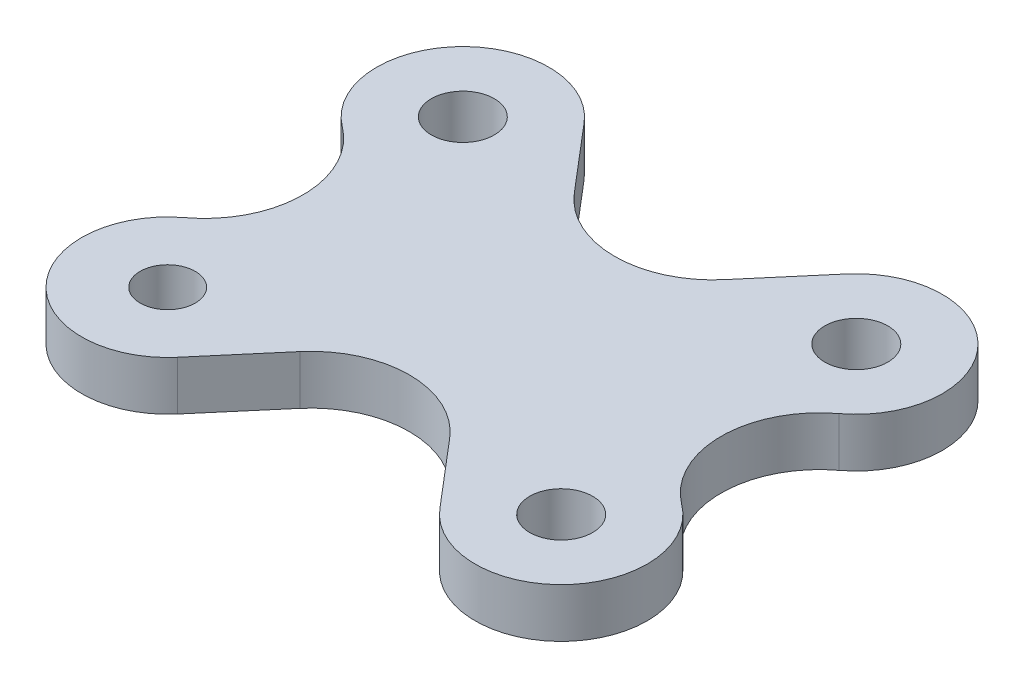
ISO-10303-21;
HEADER;
FILE_DESCRIPTION(('STEP AP214'),'2;1');
FILE_NAME('part.step','',(''),(''),'','','');
FILE_SCHEMA(('AUTOMOTIVE_DESIGN { 1 0 10303 214 1 1 1 1 }'));
ENDSEC;
DATA;
#1=APPLICATION_CONTEXT('core data for automotive mechanical design processes');
#2=APPLICATION_PROTOCOL_DEFINITION('international standard','automotive_design',2000,#1);
#3=PRODUCT_CONTEXT('',#1,'mechanical');
#4=PRODUCT('Part','Part','',(#3));
#5=PRODUCT_RELATED_PRODUCT_CATEGORY('part','',(#4));
#6=PRODUCT_DEFINITION_FORMATION('','',#4);
#7=PRODUCT_DEFINITION_CONTEXT('part definition',#1,'design');
#8=PRODUCT_DEFINITION('design','',#6,#7);
#9=PRODUCT_DEFINITION_SHAPE('','',#8);
#10=(LENGTH_UNIT() NAMED_UNIT(*) SI_UNIT(.MILLI.,.METRE.));
#11=(NAMED_UNIT(*) PLANE_ANGLE_UNIT() SI_UNIT($,.RADIAN.));
#12=(NAMED_UNIT(*) SI_UNIT($,.STERADIAN.) SOLID_ANGLE_UNIT());
#13=UNCERTAINTY_MEASURE_WITH_UNIT(LENGTH_MEASURE(1.E-05),#10,'distance_accuracy_value','');
#14=(GEOMETRIC_REPRESENTATION_CONTEXT(3) GLOBAL_UNCERTAINTY_ASSIGNED_CONTEXT((#13)) GLOBAL_UNIT_ASSIGNED_CONTEXT((#10,
#11,#12)) REPRESENTATION_CONTEXT('',''));
#15=CARTESIAN_POINT('',(0.,0.,0.));
#16=DIRECTION('',(0.,0.,1.));
#17=DIRECTION('',(1.,0.,0.));
#18=AXIS2_PLACEMENT_3D('',#15,#16,#17);
#19=CARTESIAN_POINT('',(-12.7,3.175,9.525));
#20=DIRECTION('',(0.,-1.,0.));
#21=DIRECTION('',(0.,0.,-1.));
#22=AXIS2_PLACEMENT_3D('',#19,#20,#21);
#23=CYLINDRICAL_SURFACE('',#22,5.55625);
#24=CARTESIAN_POINT('',(-12.7,3.175,9.525));
#25=DIRECTION('',(0.,1.,0.));
#26=DIRECTION('',(0.,0.,1.));
#27=AXIS2_PLACEMENT_3D('',#24,#25,#26);
#28=CIRCLE('',#27,5.55625);
#29=CARTESIAN_POINT('',(-16.03375,3.175,5.08));
#30=VERTEX_POINT('',#29);
#31=CARTESIAN_POINT('',(-8.46862702876966,3.175,13.1260271924607));
#32=VERTEX_POINT('',#31);
#33=EDGE_CURVE('E146',#30,#32,#28,.T.);
#34=ORIENTED_EDGE('',*,*,#33,.F.);
#35=DIRECTION('',(0.,-1.,0.));
#36=VECTOR('',#35,1.);
#37=CARTESIAN_POINT('',(-16.03375,3.175,5.08));
#38=LINE('',#37,#36);
#39=CARTESIAN_POINT('',(-16.03375,0.,5.08));
#40=VERTEX_POINT('',#39);
#41=EDGE_CURVE('E180',#30,#40,#38,.T.);
#42=ORIENTED_EDGE('',*,*,#41,.T.);
#43=CARTESIAN_POINT('',(-12.7,0.,9.525));
#44=DIRECTION('',(0.,1.,0.));
#45=DIRECTION('',(0.,0.,1.));
#46=AXIS2_PLACEMENT_3D('',#43,#44,#45);
#47=CIRCLE('',#46,5.55625);
#48=CARTESIAN_POINT('',(-8.46862702876966,0.,13.1260271924607));
#49=VERTEX_POINT('',#48);
#50=EDGE_CURVE('E165',#40,#49,#47,.T.);
#51=ORIENTED_EDGE('',*,*,#50,.T.);
#52=DIRECTION('',(0.,-1.,0.));
#53=VECTOR('',#52,1.);
#54=CARTESIAN_POINT('',(-8.46862702876966,3.175,13.1260271924607));
#55=LINE('',#54,#53);
#56=EDGE_CURVE('E161',#32,#49,#55,.T.);
#57=ORIENTED_EDGE('',*,*,#56,.F.);
#58=EDGE_LOOP('',(#34,#42,#51,#57));
#59=FACE_BOUND('',#58,.T.);
#60=ADVANCED_FACE('F45',(#59),#23,.T.);
#61=CARTESIAN_POINT('',(-8.46862702876966,3.175,13.1260271924607));
#62=DIRECTION('',(-0.761551940828858,0.,-0.648103881657716));
#63=DIRECTION('',(-0.648103881657716,0.,0.761551940828858));
#64=AXIS2_PLACEMENT_3D('',#61,#62,#63);
#65=PLANE('',#64);
#66=DIRECTION('',(0.648103881657716,0.,-0.761551940828858));
#67=VECTOR('',#66,1.);
#68=CARTESIAN_POINT('',(-8.46862702876966,0.,13.1260271924607));
#69=LINE('',#68,#67);
#70=CARTESIAN_POINT('',(-4.83585482426325,0.,8.8573523685193));
#71=VERTEX_POINT('',#70);
#72=EDGE_CURVE('E261',#49,#71,#69,.T.);
#73=ORIENTED_EDGE('',*,*,#72,.T.);
#74=DIRECTION('',(0.,-1.,0.));
#75=VECTOR('',#74,1.);
#76=CARTESIAN_POINT('',(-4.83585482426325,3.175,8.8573523685193));
#77=LINE('',#76,#75);
#78=CARTESIAN_POINT('',(-4.83585482426325,3.175,8.8573523685193));
#79=VERTEX_POINT('',#78);
#80=EDGE_CURVE('E61',#71,#79,#77,.F.);
#81=ORIENTED_EDGE('',*,*,#80,.T.);
#82=DIRECTION('',(0.648103881657716,0.,-0.761551940828858));
#83=VECTOR('',#82,1.);
#84=CARTESIAN_POINT('',(-8.46862702876966,3.175,13.1260271924607));
#85=LINE('',#84,#83);
#86=EDGE_CURVE('E149',#32,#79,#85,.T.);
#87=ORIENTED_EDGE('',*,*,#86,.F.);
#88=ORIENTED_EDGE('',*,*,#56,.T.);
#89=EDGE_LOOP('',(#73,#81,#87,#88));
#90=FACE_BOUND('',#89,.T.);
#91=ADVANCED_FACE('F160',(#90),#65,.F.);
#92=CARTESIAN_POINT('',(0.,3.175,3.175));
#93=DIRECTION('',(0.761551940828858,0.,-0.648103881657716));
#94=DIRECTION('',(-0.648103881657716,0.,-0.761551940828858));
#95=AXIS2_PLACEMENT_3D('',#92,#93,#94);
#96=PLANE('',#95);
#97=DIRECTION('',(0.648103881657716,0.,0.761551940828858));
#98=VECTOR('',#97,1.);
#99=CARTESIAN_POINT('',(0.,3.175,3.175));
#100=LINE('',#99,#98);
#101=CARTESIAN_POINT('',(4.83585482426325,3.175,8.8573523685193));
#102=VERTEX_POINT('',#101);
#103=CARTESIAN_POINT('',(8.46862702876966,3.175,13.1260271924607));
#104=VERTEX_POINT('',#103);
#105=EDGE_CURVE('E162',#102,#104,#100,.T.);
#106=ORIENTED_EDGE('',*,*,#105,.F.);
#107=DIRECTION('',(0.,-1.,0.));
#108=VECTOR('',#107,1.);
#109=CARTESIAN_POINT('',(4.83585482426325,0.,8.8573523685193));
#110=LINE('',#109,#108);
#111=CARTESIAN_POINT('',(4.83585482426325,0.,8.8573523685193));
#112=VERTEX_POINT('',#111);
#113=EDGE_CURVE('E191',#102,#112,#110,.T.);
#114=ORIENTED_EDGE('',*,*,#113,.T.);
#115=DIRECTION('',(0.648103881657716,0.,0.761551940828858));
#116=VECTOR('',#115,1.);
#117=CARTESIAN_POINT('',(0.,0.,3.175));
#118=LINE('',#117,#116);
#119=CARTESIAN_POINT('',(8.46862702876966,0.,13.1260271924607));
#120=VERTEX_POINT('',#119);
#121=EDGE_CURVE('E264',#112,#120,#118,.T.);
#122=ORIENTED_EDGE('',*,*,#121,.T.);
#123=DIRECTION('',(0.,-1.,0.));
#124=VECTOR('',#123,1.);
#125=CARTESIAN_POINT('',(8.46862702876966,3.175,13.1260271924607));
#126=LINE('',#125,#124);
#127=EDGE_CURVE('E167',#104,#120,#126,.T.);
#128=ORIENTED_EDGE('',*,*,#127,.F.);
#129=EDGE_LOOP('',(#106,#114,#122,#128));
#130=FACE_BOUND('',#129,.T.);
#131=ADVANCED_FACE('F303',(#130),#96,.F.);
#132=CARTESIAN_POINT('',(12.7,3.175,9.525));
#133=DIRECTION('',(0.,-1.,0.));
#134=DIRECTION('',(0.,0.,-1.));
#135=AXIS2_PLACEMENT_3D('',#132,#133,#134);
#136=CYLINDRICAL_SURFACE('',#135,5.55625);
#137=CARTESIAN_POINT('',(12.7,0.,9.525));
#138=DIRECTION('',(0.,1.,0.));
#139=DIRECTION('',(0.,0.,1.));
#140=AXIS2_PLACEMENT_3D('',#137,#138,#139);
#141=CIRCLE('',#140,5.55625);
#142=CARTESIAN_POINT('',(16.03375,0.,5.08));
#143=VERTEX_POINT('',#142);
#144=EDGE_CURVE('E221',#120,#143,#141,.T.);
#145=ORIENTED_EDGE('',*,*,#144,.T.);
#146=DIRECTION('',(0.,-1.,0.));
#147=VECTOR('',#146,1.);
#148=CARTESIAN_POINT('',(16.03375,3.175,5.08));
#149=LINE('',#148,#147);
#150=CARTESIAN_POINT('',(16.03375,3.175,5.08));
#151=VERTEX_POINT('',#150);
#152=EDGE_CURVE('E188',#143,#151,#149,.F.);
#153=ORIENTED_EDGE('',*,*,#152,.T.);
#154=CARTESIAN_POINT('',(12.7,3.175,9.525));
#155=DIRECTION('',(0.,1.,0.));
#156=DIRECTION('',(0.,0.,1.));
#157=AXIS2_PLACEMENT_3D('',#154,#155,#156);
#158=CIRCLE('',#157,5.55625);
#159=EDGE_CURVE('E216',#104,#151,#158,.T.);
#160=ORIENTED_EDGE('',*,*,#159,.F.);
#161=ORIENTED_EDGE('',*,*,#127,.T.);
#162=EDGE_LOOP('',(#145,#153,#160,#161));
#163=FACE_BOUND('',#162,.T.);
#164=ADVANCED_FACE('F271',(#163),#136,.T.);
#165=CARTESIAN_POINT('',(12.7,3.175,-9.525));
#166=DIRECTION('',(0.,-1.,0.));
#167=DIRECTION('',(0.,0.,-1.));
#168=AXIS2_PLACEMENT_3D('',#165,#166,#167);
#169=CYLINDRICAL_SURFACE('',#168,5.55625);
#170=CARTESIAN_POINT('',(12.7,3.175,-9.525));
#171=DIRECTION('',(0.,1.,0.));
#172=DIRECTION('',(0.,0.,1.));
#173=AXIS2_PLACEMENT_3D('',#170,#171,#172);
#174=CIRCLE('',#173,5.55625);
#175=CARTESIAN_POINT('',(16.03375,3.175,-5.08));
#176=VERTEX_POINT('',#175);
#177=CARTESIAN_POINT('',(8.46862702876966,3.175,-13.1260271924607));
#178=VERTEX_POINT('',#177);
#179=EDGE_CURVE('E213',#176,#178,#174,.T.);
#180=ORIENTED_EDGE('',*,*,#179,.F.);
#181=DIRECTION('',(0.,-1.,0.));
#182=VECTOR('',#181,1.);
#183=CARTESIAN_POINT('',(16.03375,3.175,-5.08));
#184=LINE('',#183,#182);
#185=CARTESIAN_POINT('',(16.03375,0.,-5.08));
#186=VERTEX_POINT('',#185);
#187=EDGE_CURVE('E184',#176,#186,#184,.T.);
#188=ORIENTED_EDGE('',*,*,#187,.T.);
#189=CARTESIAN_POINT('',(12.7,0.,-9.525));
#190=DIRECTION('',(0.,1.,0.));
#191=DIRECTION('',(0.,0.,1.));
#192=AXIS2_PLACEMENT_3D('',#189,#190,#191);
#193=CIRCLE('',#192,5.55625);
#194=CARTESIAN_POINT('',(8.46862702876966,0.,-13.1260271924607));
#195=VERTEX_POINT('',#194);
#196=EDGE_CURVE('E218',#186,#195,#193,.T.);
#197=ORIENTED_EDGE('',*,*,#196,.T.);
#198=DIRECTION('',(0.,-1.,0.));
#199=VECTOR('',#198,1.);
#200=CARTESIAN_POINT('',(8.46862702876966,3.175,-13.1260271924607));
#201=LINE('',#200,#199);
#202=EDGE_CURVE('E174',#178,#195,#201,.T.);
#203=ORIENTED_EDGE('',*,*,#202,.F.);
#204=EDGE_LOOP('',(#180,#188,#197,#203));
#205=FACE_BOUND('',#204,.T.);
#206=ADVANCED_FACE('F282',(#205),#169,.T.);
#207=CARTESIAN_POINT('',(8.46862702876966,3.175,-13.1260271924607));
#208=DIRECTION('',(0.761551940828858,0.,0.648103881657716));
#209=DIRECTION('',(0.648103881657716,0.,-0.761551940828858));
#210=AXIS2_PLACEMENT_3D('',#207,#208,#209);
#211=PLANE('',#210);
#212=DIRECTION('',(-0.648103881657716,0.,0.761551940828858));
#213=VECTOR('',#212,1.);
#214=CARTESIAN_POINT('',(8.46862702876966,0.,-13.1260271924607));
#215=LINE('',#214,#213);
#216=CARTESIAN_POINT('',(4.83585482426325,0.,-8.8573523685193));
#217=VERTEX_POINT('',#216);
#218=EDGE_CURVE('E220',#195,#217,#215,.T.);
#219=ORIENTED_EDGE('',*,*,#218,.T.);
#220=DIRECTION('',(0.,-1.,0.));
#221=VECTOR('',#220,1.);
#222=CARTESIAN_POINT('',(4.83585482426325,3.175,-8.8573523685193));
#223=LINE('',#222,#221);
#224=CARTESIAN_POINT('',(4.83585482426325,3.175,-8.8573523685193));
#225=VERTEX_POINT('',#224);
#226=EDGE_CURVE('E170',#217,#225,#223,.F.);
#227=ORIENTED_EDGE('',*,*,#226,.T.);
#228=DIRECTION('',(-0.648103881657716,0.,0.761551940828858));
#229=VECTOR('',#228,1.);
#230=CARTESIAN_POINT('',(8.46862702876966,3.175,-13.1260271924607));
#231=LINE('',#230,#229);
#232=EDGE_CURVE('E215',#178,#225,#231,.T.);
#233=ORIENTED_EDGE('',*,*,#232,.F.);
#234=ORIENTED_EDGE('',*,*,#202,.T.);
#235=EDGE_LOOP('',(#219,#227,#233,#234));
#236=FACE_BOUND('',#235,.T.);
#237=ADVANCED_FACE('F285',(#236),#211,.F.);
#238=CARTESIAN_POINT('',(0.,3.175,-3.175));
#239=DIRECTION('',(-0.761551940828858,0.,0.648103881657716));
#240=DIRECTION('',(0.648103881657716,0.,0.761551940828858));
#241=AXIS2_PLACEMENT_3D('',#238,#239,#240);
#242=PLANE('',#241);
#243=DIRECTION('',(-0.648103881657716,0.,-0.761551940828858));
#244=VECTOR('',#243,1.);
#245=CARTESIAN_POINT('',(0.,3.175,-3.175));
#246=LINE('',#245,#244);
#247=CARTESIAN_POINT('',(-4.83585482426325,3.175,-8.8573523685193));
#248=VERTEX_POINT('',#247);
#249=CARTESIAN_POINT('',(-8.46862702876965,3.175,-13.1260271924607));
#250=VERTEX_POINT('',#249);
#251=EDGE_CURVE('E234',#248,#250,#246,.T.);
#252=ORIENTED_EDGE('',*,*,#251,.F.);
#253=DIRECTION('',(0.,-1.,0.));
#254=VECTOR('',#253,1.);
#255=CARTESIAN_POINT('',(-4.83585482426325,0.,-8.8573523685193));
#256=LINE('',#255,#254);
#257=CARTESIAN_POINT('',(-4.83585482426325,0.,-8.8573523685193));
#258=VERTEX_POINT('',#257);
#259=EDGE_CURVE('E166',#248,#258,#256,.T.);
#260=ORIENTED_EDGE('',*,*,#259,.T.);
#261=DIRECTION('',(-0.648103881657716,0.,-0.761551940828858));
#262=VECTOR('',#261,1.);
#263=CARTESIAN_POINT('',(0.,0.,-3.175));
#264=LINE('',#263,#262);
#265=CARTESIAN_POINT('',(-8.46862702876965,0.,-13.1260271924607));
#266=VERTEX_POINT('',#265);
#267=EDGE_CURVE('E241',#258,#266,#264,.T.);
#268=ORIENTED_EDGE('',*,*,#267,.T.);
#269=DIRECTION('',(0.,-1.,0.));
#270=VECTOR('',#269,1.);
#271=CARTESIAN_POINT('',(-8.46862702876965,3.175,-13.1260271924607));
#272=LINE('',#271,#270);
#273=EDGE_CURVE('E239',#250,#266,#272,.T.);
#274=ORIENTED_EDGE('',*,*,#273,.F.);
#275=EDGE_LOOP('',(#252,#260,#268,#274));
#276=FACE_BOUND('',#275,.T.);
#277=ADVANCED_FACE('F293',(#276),#242,.F.);
#278=CARTESIAN_POINT('',(-12.7,3.175,-9.525));
#279=DIRECTION('',(0.,-1.,0.));
#280=DIRECTION('',(0.,0.,-1.));
#281=AXIS2_PLACEMENT_3D('',#278,#279,#280);
#282=CYLINDRICAL_SURFACE('',#281,5.55625);
#283=CARTESIAN_POINT('',(-12.7,0.,-9.525));
#284=DIRECTION('',(0.,1.,0.));
#285=DIRECTION('',(0.,0.,1.));
#286=AXIS2_PLACEMENT_3D('',#283,#284,#285);
#287=CIRCLE('',#286,5.55625);
#288=CARTESIAN_POINT('',(-16.03375,0.,-5.08));
#289=VERTEX_POINT('',#288);
#290=EDGE_CURVE('E157',#266,#289,#287,.T.);
#291=ORIENTED_EDGE('',*,*,#290,.T.);
#292=DIRECTION('',(0.,-1.,0.));
#293=VECTOR('',#292,1.);
#294=CARTESIAN_POINT('',(-16.03375,3.175,-5.08));
#295=LINE('',#294,#293);
#296=CARTESIAN_POINT('',(-16.03375,3.175,-5.08));
#297=VERTEX_POINT('',#296);
#298=EDGE_CURVE('E182',#289,#297,#295,.F.);
#299=ORIENTED_EDGE('',*,*,#298,.T.);
#300=CARTESIAN_POINT('',(-12.7,3.175,-9.525));
#301=DIRECTION('',(0.,1.,0.));
#302=DIRECTION('',(0.,0.,1.));
#303=AXIS2_PLACEMENT_3D('',#300,#301,#302);
#304=CIRCLE('',#303,5.55625);
#305=EDGE_CURVE('E252',#250,#297,#304,.T.);
#306=ORIENTED_EDGE('',*,*,#305,.F.);
#307=ORIENTED_EDGE('',*,*,#273,.T.);
#308=EDGE_LOOP('',(#291,#299,#306,#307));
#309=FACE_BOUND('',#308,.T.);
#310=ADVANCED_FACE('F296',(#309),#282,.T.);
#311=CARTESIAN_POINT('',(-12.7,3.175,9.525));
#312=DIRECTION('',(0.,1.,0.));
#313=DIRECTION('',(0.,0.,1.));
#314=AXIS2_PLACEMENT_3D('',#311,#312,#313);
#315=PLANE('',#314);
#316=CARTESIAN_POINT('',(-12.7,3.175,9.525));
#317=DIRECTION('',(0.,1.,0.));
#318=DIRECTION('',(0.,0.,1.));
#319=AXIS2_PLACEMENT_3D('',#316,#317,#318);
#320=CIRCLE('',#319,1.778);
#321=CARTESIAN_POINT('',(-12.7,3.175,11.303));
#322=VERTEX_POINT('',#321);
#323=EDGE_CURVE('E316',#322,#322,#320,.T.);
#324=ORIENTED_EDGE('',*,*,#323,.F.);
#325=EDGE_LOOP('',(#324));
#326=FACE_BOUND('',#325,.T.);
#327=CARTESIAN_POINT('',(12.7,3.175,9.525));
#328=DIRECTION('',(0.,1.,0.));
#329=DIRECTION('',(0.,0.,1.));
#330=AXIS2_PLACEMENT_3D('',#327,#328,#329);
#331=CIRCLE('',#330,2.032);
#332=CARTESIAN_POINT('',(12.7,3.175,11.557));
#333=VERTEX_POINT('',#332);
#334=EDGE_CURVE('E231',#333,#333,#331,.T.);
#335=ORIENTED_EDGE('',*,*,#334,.F.);
#336=EDGE_LOOP('',(#335));
#337=FACE_BOUND('',#336,.T.);
#338=CARTESIAN_POINT('',(12.7,3.175,-9.525));
#339=DIRECTION('',(0.,1.,0.));
#340=DIRECTION('',(0.,0.,1.));
#341=AXIS2_PLACEMENT_3D('',#338,#339,#340);
#342=CIRCLE('',#341,2.032);
#343=CARTESIAN_POINT('',(12.7,3.175,-7.493));
#344=VERTEX_POINT('',#343);
#345=EDGE_CURVE('E223',#344,#344,#342,.T.);
#346=ORIENTED_EDGE('',*,*,#345,.F.);
#347=EDGE_LOOP('',(#346));
#348=FACE_BOUND('',#347,.T.);
#349=CARTESIAN_POINT('',(-12.7,3.175,-9.525));
#350=DIRECTION('',(0.,1.,0.));
#351=DIRECTION('',(0.,0.,1.));
#352=AXIS2_PLACEMENT_3D('',#349,#350,#351);
#353=CIRCLE('',#352,2.032);
#354=CARTESIAN_POINT('',(-12.7,3.175,-7.493));
#355=VERTEX_POINT('',#354);
#356=EDGE_CURVE('E226',#355,#355,#353,.T.);
#357=ORIENTED_EDGE('',*,*,#356,.F.);
#358=EDGE_LOOP('',(#357));
#359=FACE_BOUND('',#358,.T.);
#360=ORIENTED_EDGE('',*,*,#305,.T.);
#361=CARTESIAN_POINT('',(-19.84375,3.175,0.));
#362=DIRECTION('',(0.,1.,0.));
#363=DIRECTION('',(0.,0.,1.));
#364=AXIS2_PLACEMENT_3D('',#361,#362,#363);
#365=CIRCLE('',#364,6.35);
#366=EDGE_CURVE('E152',#297,#30,#365,.F.);
#367=ORIENTED_EDGE('',*,*,#366,.T.);
#368=ORIENTED_EDGE('',*,*,#33,.T.);
#369=ORIENTED_EDGE('',*,*,#86,.T.);
#370=CARTESIAN_POINT('',(0.,3.175,12.9728120170458));
#371=DIRECTION('',(0.,1.,0.));
#372=DIRECTION('',(0.,0.,1.));
#373=AXIS2_PLACEMENT_3D('',#370,#371,#372);
#374=CIRCLE('',#373,6.35);
#375=EDGE_CURVE('E11',#79,#102,#374,.F.);
#376=ORIENTED_EDGE('',*,*,#375,.T.);
#377=ORIENTED_EDGE('',*,*,#105,.T.);
#378=ORIENTED_EDGE('',*,*,#159,.T.);
#379=CARTESIAN_POINT('',(19.84375,3.175,0.));
#380=DIRECTION('',(0.,1.,0.));
#381=DIRECTION('',(0.,0.,1.));
#382=AXIS2_PLACEMENT_3D('',#379,#380,#381);
#383=CIRCLE('',#382,6.35);
#384=EDGE_CURVE('E208',#151,#176,#383,.F.);
#385=ORIENTED_EDGE('',*,*,#384,.T.);
#386=ORIENTED_EDGE('',*,*,#179,.T.);
#387=ORIENTED_EDGE('',*,*,#232,.T.);
#388=CARTESIAN_POINT('',(0.,3.175,-12.9728120170458));
#389=DIRECTION('',(0.,1.,0.));
#390=DIRECTION('',(0.,0.,1.));
#391=AXIS2_PLACEMENT_3D('',#388,#389,#390);
#392=CIRCLE('',#391,6.35);
#393=EDGE_CURVE('E199',#225,#248,#392,.F.);
#394=ORIENTED_EDGE('',*,*,#393,.T.);
#395=ORIENTED_EDGE('',*,*,#251,.T.);
#396=EDGE_LOOP('',(#360,#367,#368,#369,#376,#377,#378,#385,#386,#387,#394,#395));
#397=FACE_BOUND('',#396,.T.);
#398=ADVANCED_FACE('F148',(#326,#337,#348,#359,#397),#315,.T.);
#399=CARTESIAN_POINT('',(-12.7,0.,9.525));
#400=DIRECTION('',(0.,1.,0.));
#401=DIRECTION('',(0.,0.,1.));
#402=AXIS2_PLACEMENT_3D('',#399,#400,#401);
#403=PLANE('',#402);
#404=CARTESIAN_POINT('',(-12.7,0.,9.525));
#405=DIRECTION('',(0.,1.,0.));
#406=DIRECTION('',(0.,0.,1.));
#407=AXIS2_PLACEMENT_3D('',#404,#405,#406);
#408=CIRCLE('',#407,1.778);
#409=CARTESIAN_POINT('',(-12.7,0.,11.303));
#410=VERTEX_POINT('',#409);
#411=EDGE_CURVE('E313',#410,#410,#408,.T.);
#412=ORIENTED_EDGE('',*,*,#411,.T.);
#413=EDGE_LOOP('',(#412));
#414=FACE_BOUND('',#413,.T.);
#415=CARTESIAN_POINT('',(12.7,0.,9.525));
#416=DIRECTION('',(0.,1.,0.));
#417=DIRECTION('',(0.,0.,1.));
#418=AXIS2_PLACEMENT_3D('',#415,#416,#417);
#419=CIRCLE('',#418,2.032);
#420=CARTESIAN_POINT('',(12.7,0.,11.557));
#421=VERTEX_POINT('',#420);
#422=EDGE_CURVE('E319',#421,#421,#419,.T.);
#423=ORIENTED_EDGE('',*,*,#422,.T.);
#424=EDGE_LOOP('',(#423));
#425=FACE_BOUND('',#424,.T.);
#426=CARTESIAN_POINT('',(12.7,0.,-9.525));
#427=DIRECTION('',(0.,1.,0.));
#428=DIRECTION('',(0.,0.,1.));
#429=AXIS2_PLACEMENT_3D('',#426,#427,#428);
#430=CIRCLE('',#429,2.032);
#431=CARTESIAN_POINT('',(12.7,0.,-7.493));
#432=VERTEX_POINT('',#431);
#433=EDGE_CURVE('E227',#432,#432,#430,.T.);
#434=ORIENTED_EDGE('',*,*,#433,.T.);
#435=EDGE_LOOP('',(#434));
#436=FACE_BOUND('',#435,.T.);
#437=CARTESIAN_POINT('',(-12.7,0.,-9.525));
#438=DIRECTION('',(0.,1.,0.));
#439=DIRECTION('',(0.,0.,1.));
#440=AXIS2_PLACEMENT_3D('',#437,#438,#439);
#441=CIRCLE('',#440,2.032);
#442=CARTESIAN_POINT('',(-12.7,0.,-7.493));
#443=VERTEX_POINT('',#442);
#444=EDGE_CURVE('E262',#443,#443,#441,.T.);
#445=ORIENTED_EDGE('',*,*,#444,.T.);
#446=EDGE_LOOP('',(#445));
#447=FACE_BOUND('',#446,.T.);
#448=ORIENTED_EDGE('',*,*,#50,.F.);
#449=CARTESIAN_POINT('',(-19.84375,0.,0.));
#450=DIRECTION('',(0.,1.,0.));
#451=DIRECTION('',(0.,0.,1.));
#452=AXIS2_PLACEMENT_3D('',#449,#450,#451);
#453=CIRCLE('',#452,6.35);
#454=EDGE_CURVE('E202',#40,#289,#453,.T.);
#455=ORIENTED_EDGE('',*,*,#454,.T.);
#456=ORIENTED_EDGE('',*,*,#290,.F.);
#457=ORIENTED_EDGE('',*,*,#267,.F.);
#458=CARTESIAN_POINT('',(0.,0.,-12.9728120170458));
#459=DIRECTION('',(0.,1.,0.));
#460=DIRECTION('',(0.,0.,1.));
#461=AXIS2_PLACEMENT_3D('',#458,#459,#460);
#462=CIRCLE('',#461,6.35);
#463=EDGE_CURVE('E196',#258,#217,#462,.T.);
#464=ORIENTED_EDGE('',*,*,#463,.T.);
#465=ORIENTED_EDGE('',*,*,#218,.F.);
#466=ORIENTED_EDGE('',*,*,#196,.F.);
#467=CARTESIAN_POINT('',(19.84375,0.,0.));
#468=DIRECTION('',(0.,1.,0.));
#469=DIRECTION('',(0.,0.,1.));
#470=AXIS2_PLACEMENT_3D('',#467,#468,#469);
#471=CIRCLE('',#470,6.35);
#472=EDGE_CURVE('E205',#186,#143,#471,.T.);
#473=ORIENTED_EDGE('',*,*,#472,.T.);
#474=ORIENTED_EDGE('',*,*,#144,.F.);
#475=ORIENTED_EDGE('',*,*,#121,.F.);
#476=CARTESIAN_POINT('',(0.,0.,12.9728120170458));
#477=DIRECTION('',(0.,1.,0.));
#478=DIRECTION('',(0.,0.,1.));
#479=AXIS2_PLACEMENT_3D('',#476,#477,#478);
#480=CIRCLE('',#479,6.35);
#481=EDGE_CURVE('E54',#112,#71,#480,.T.);
#482=ORIENTED_EDGE('',*,*,#481,.T.);
#483=ORIENTED_EDGE('',*,*,#72,.F.);
#484=EDGE_LOOP('',(#448,#455,#456,#457,#464,#465,#466,#473,#474,#475,#482,#483));
#485=FACE_BOUND('',#484,.T.);
#486=ADVANCED_FACE('F294',(#414,#425,#436,#447,#485),#403,.F.);
#487=CARTESIAN_POINT('',(0.,3.175,-12.9728120170458));
#488=DIRECTION('',(0.,1.,0.));
#489=DIRECTION('',(0.,0.,1.));
#490=AXIS2_PLACEMENT_3D('',#487,#488,#489);
#491=CYLINDRICAL_SURFACE('',#490,6.35);
#492=ORIENTED_EDGE('',*,*,#393,.F.);
#493=ORIENTED_EDGE('',*,*,#226,.F.);
#494=ORIENTED_EDGE('',*,*,#463,.F.);
#495=ORIENTED_EDGE('',*,*,#259,.F.);
#496=EDGE_LOOP('',(#492,#493,#494,#495));
#497=FACE_BOUND('',#496,.T.);
#498=ADVANCED_FACE('F290',(#497),#491,.F.);
#499=CARTESIAN_POINT('',(-19.84375,3.175,0.));
#500=DIRECTION('',(0.,1.,0.));
#501=DIRECTION('',(0.,0.,1.));
#502=AXIS2_PLACEMENT_3D('',#499,#500,#501);
#503=CYLINDRICAL_SURFACE('',#502,6.35);
#504=ORIENTED_EDGE('',*,*,#366,.F.);
#505=ORIENTED_EDGE('',*,*,#298,.F.);
#506=ORIENTED_EDGE('',*,*,#454,.F.);
#507=ORIENTED_EDGE('',*,*,#41,.F.);
#508=EDGE_LOOP('',(#504,#505,#506,#507));
#509=FACE_BOUND('',#508,.T.);
#510=ADVANCED_FACE('F298',(#509),#503,.F.);
#511=CARTESIAN_POINT('',(19.84375,3.175,0.));
#512=DIRECTION('',(0.,1.,0.));
#513=DIRECTION('',(0.,0.,1.));
#514=AXIS2_PLACEMENT_3D('',#511,#512,#513);
#515=CYLINDRICAL_SURFACE('',#514,6.35);
#516=ORIENTED_EDGE('',*,*,#384,.F.);
#517=ORIENTED_EDGE('',*,*,#152,.F.);
#518=ORIENTED_EDGE('',*,*,#472,.F.);
#519=ORIENTED_EDGE('',*,*,#187,.F.);
#520=EDGE_LOOP('',(#516,#517,#518,#519));
#521=FACE_BOUND('',#520,.T.);
#522=ADVANCED_FACE('F277',(#521),#515,.F.);
#523=CARTESIAN_POINT('',(0.,3.175,12.9728120170458));
#524=DIRECTION('',(0.,1.,0.));
#525=DIRECTION('',(0.,0.,1.));
#526=AXIS2_PLACEMENT_3D('',#523,#524,#525);
#527=CYLINDRICAL_SURFACE('',#526,6.35);
#528=ORIENTED_EDGE('',*,*,#375,.F.);
#529=ORIENTED_EDGE('',*,*,#80,.F.);
#530=ORIENTED_EDGE('',*,*,#481,.F.);
#531=ORIENTED_EDGE('',*,*,#113,.F.);
#532=EDGE_LOOP('',(#528,#529,#530,#531));
#533=FACE_BOUND('',#532,.T.);
#534=ADVANCED_FACE('F47',(#533),#527,.F.);
#535=CARTESIAN_POINT('',(-12.7,0.,-9.525));
#536=DIRECTION('',(0.,1.,0.));
#537=DIRECTION('',(0.,0.,1.));
#538=AXIS2_PLACEMENT_3D('',#535,#536,#537);
#539=CYLINDRICAL_SURFACE('',#538,2.032);
#540=ORIENTED_EDGE('',*,*,#444,.F.);
#541=EDGE_LOOP('',(#540));
#542=FACE_BOUND('',#541,.T.);
#543=ORIENTED_EDGE('',*,*,#356,.T.);
#544=EDGE_LOOP('',(#543));
#545=FACE_BOUND('',#544,.T.);
#546=ADVANCED_FACE('F336',(#542,#545),#539,.F.);
#547=CARTESIAN_POINT('',(12.7,0.,-9.525));
#548=DIRECTION('',(0.,1.,0.));
#549=DIRECTION('',(0.,0.,1.));
#550=AXIS2_PLACEMENT_3D('',#547,#548,#549);
#551=CYLINDRICAL_SURFACE('',#550,2.032);
#552=ORIENTED_EDGE('',*,*,#433,.F.);
#553=EDGE_LOOP('',(#552));
#554=FACE_BOUND('',#553,.T.);
#555=ORIENTED_EDGE('',*,*,#345,.T.);
#556=EDGE_LOOP('',(#555));
#557=FACE_BOUND('',#556,.T.);
#558=ADVANCED_FACE('F338',(#554,#557),#551,.F.);
#559=CARTESIAN_POINT('',(12.7,0.,9.525));
#560=DIRECTION('',(0.,1.,0.));
#561=DIRECTION('',(0.,0.,1.));
#562=AXIS2_PLACEMENT_3D('',#559,#560,#561);
#563=CYLINDRICAL_SURFACE('',#562,2.032);
#564=ORIENTED_EDGE('',*,*,#422,.F.);
#565=EDGE_LOOP('',(#564));
#566=FACE_BOUND('',#565,.T.);
#567=ORIENTED_EDGE('',*,*,#334,.T.);
#568=EDGE_LOOP('',(#567));
#569=FACE_BOUND('',#568,.T.);
#570=ADVANCED_FACE('F326',(#566,#569),#563,.F.);
#571=CARTESIAN_POINT('',(-12.7,0.,9.525));
#572=DIRECTION('',(0.,1.,0.));
#573=DIRECTION('',(0.,0.,1.));
#574=AXIS2_PLACEMENT_3D('',#571,#572,#573);
#575=CYLINDRICAL_SURFACE('',#574,1.778);
#576=ORIENTED_EDGE('',*,*,#411,.F.);
#577=EDGE_LOOP('',(#576));
#578=FACE_BOUND('',#577,.T.);
#579=ORIENTED_EDGE('',*,*,#323,.T.);
#580=EDGE_LOOP('',(#579));
#581=FACE_BOUND('',#580,.T.);
#582=ADVANCED_FACE('F440',(#578,#581),#575,.F.);
#583=CLOSED_SHELL('',(#60,#91,#131,#164,#206,#237,#277,#310,#398,#486,#498,#510,#522,#534,#546,
#558,#570,#582));
#584=MANIFOLD_SOLID_BREP('B2',#583);
#585=ADVANCED_BREP_SHAPE_REPRESENTATION('',(#18,#584),#14);
#586=SHAPE_DEFINITION_REPRESENTATION(#9,#585);
ENDSEC;
END-ISO-10303-21;
